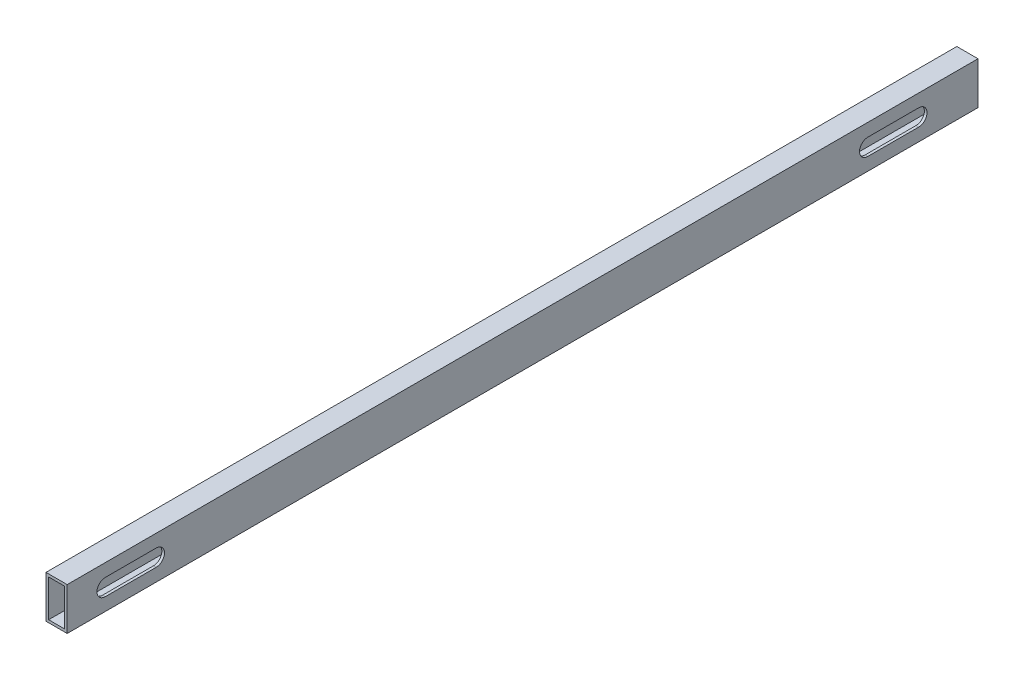
ISO-10303-21;
HEADER;
FILE_DESCRIPTION(('STEP AP214'),'2;1');
FILE_NAME('part.step','',(''),(''),'','','');
FILE_SCHEMA(('AUTOMOTIVE_DESIGN { 1 0 10303 214 1 1 1 1 }'));
ENDSEC;
DATA;
#1=APPLICATION_CONTEXT('core data for automotive mechanical design processes');
#2=APPLICATION_PROTOCOL_DEFINITION('international standard','automotive_design',2000,#1);
#3=PRODUCT_CONTEXT('',#1,'mechanical');
#4=PRODUCT('Part','Part','',(#3));
#5=PRODUCT_RELATED_PRODUCT_CATEGORY('part','',(#4));
#6=PRODUCT_DEFINITION_FORMATION('','',#4);
#7=PRODUCT_DEFINITION_CONTEXT('part definition',#1,'design');
#8=PRODUCT_DEFINITION('design','',#6,#7);
#9=PRODUCT_DEFINITION_SHAPE('','',#8);
#10=(LENGTH_UNIT() NAMED_UNIT(*) SI_UNIT(.MILLI.,.METRE.));
#11=(NAMED_UNIT(*) PLANE_ANGLE_UNIT() SI_UNIT($,.RADIAN.));
#12=(NAMED_UNIT(*) SI_UNIT($,.STERADIAN.) SOLID_ANGLE_UNIT());
#13=UNCERTAINTY_MEASURE_WITH_UNIT(LENGTH_MEASURE(1.E-05),#10,'distance_accuracy_value','');
#14=(GEOMETRIC_REPRESENTATION_CONTEXT(3) GLOBAL_UNCERTAINTY_ASSIGNED_CONTEXT((#13)) GLOBAL_UNIT_ASSIGNED_CONTEXT((#10,
#11,#12)) REPRESENTATION_CONTEXT('',''));
#15=CARTESIAN_POINT('',(0.,0.,0.));
#16=DIRECTION('',(0.,0.,1.));
#17=DIRECTION('',(1.,0.,0.));
#18=AXIS2_PLACEMENT_3D('',#15,#16,#17);
#19=CARTESIAN_POINT('',(6.35,-12.7,546.1));
#20=DIRECTION('',(-1.,0.,0.));
#21=DIRECTION('',(0.,0.,1.));
#22=AXIS2_PLACEMENT_3D('',#19,#20,#21);
#23=PLANE('',#22);
#24=DIRECTION('',(0.,0.,-1.));
#25=VECTOR('',#24,1.);
#26=CARTESIAN_POINT('',(6.35,5.,492.76));
#27=LINE('',#26,#25);
#28=CARTESIAN_POINT('',(6.35,5.,523.24));
#29=VERTEX_POINT('',#28);
#30=CARTESIAN_POINT('',(6.35,5.,492.76));
#31=VERTEX_POINT('',#30);
#32=EDGE_CURVE('E223',#29,#31,#27,.T.);
#33=ORIENTED_EDGE('',*,*,#32,.T.);
#34=CARTESIAN_POINT('',(6.35,0.,492.76));
#35=DIRECTION('',(-1.,0.,0.));
#36=DIRECTION('',(0.,0.,1.));
#37=AXIS2_PLACEMENT_3D('',#34,#35,#36);
#38=CIRCLE('',#37,5.);
#39=CARTESIAN_POINT('',(6.35,-5.,492.76));
#40=VERTEX_POINT('',#39);
#41=EDGE_CURVE('E216',#31,#40,#38,.T.);
#42=ORIENTED_EDGE('',*,*,#41,.T.);
#43=DIRECTION('',(0.,0.,1.));
#44=VECTOR('',#43,1.);
#45=CARTESIAN_POINT('',(6.35,-5.,492.76));
#46=LINE('',#45,#44);
#47=CARTESIAN_POINT('',(6.35,-5.,523.24));
#48=VERTEX_POINT('',#47);
#49=EDGE_CURVE('E59',#40,#48,#46,.T.);
#50=ORIENTED_EDGE('',*,*,#49,.T.);
#51=CARTESIAN_POINT('',(6.35,0.,523.24));
#52=DIRECTION('',(-1.,0.,0.));
#53=DIRECTION('',(0.,0.,1.));
#54=AXIS2_PLACEMENT_3D('',#51,#52,#53);
#55=CIRCLE('',#54,5.);
#56=EDGE_CURVE('E220',#48,#29,#55,.T.);
#57=ORIENTED_EDGE('',*,*,#56,.T.);
#58=EDGE_LOOP('',(#33,#42,#50,#57));
#59=FACE_BOUND('',#58,.T.);
#60=DIRECTION('',(0.,1.,0.));
#61=VECTOR('',#60,1.);
#62=CARTESIAN_POINT('',(6.35,-12.7,0.));
#63=LINE('',#62,#61);
#64=CARTESIAN_POINT('',(6.35,-12.7,0.));
#65=VERTEX_POINT('',#64);
#66=CARTESIAN_POINT('',(6.35,12.7,0.));
#67=VERTEX_POINT('',#66);
#68=EDGE_CURVE('E301',#65,#67,#63,.T.);
#69=ORIENTED_EDGE('',*,*,#68,.T.);
#70=DIRECTION('',(0.,0.,-1.));
#71=VECTOR('',#70,1.);
#72=CARTESIAN_POINT('',(6.35,12.7,546.1));
#73=LINE('',#72,#71);
#74=CARTESIAN_POINT('',(6.35,12.7,546.1));
#75=VERTEX_POINT('',#74);
#76=EDGE_CURVE('E328',#75,#67,#73,.T.);
#77=ORIENTED_EDGE('',*,*,#76,.F.);
#78=DIRECTION('',(0.,1.,0.));
#79=VECTOR('',#78,1.);
#80=CARTESIAN_POINT('',(6.35,-12.7,546.1));
#81=LINE('',#80,#79);
#82=CARTESIAN_POINT('',(6.35,-12.7,546.1));
#83=VERTEX_POINT('',#82);
#84=EDGE_CURVE('E302',#83,#75,#81,.T.);
#85=ORIENTED_EDGE('',*,*,#84,.F.);
#86=DIRECTION('',(0.,0.,-1.));
#87=VECTOR('',#86,1.);
#88=CARTESIAN_POINT('',(6.35,-12.7,546.1));
#89=LINE('',#88,#87);
#90=EDGE_CURVE('E312',#83,#65,#89,.T.);
#91=ORIENTED_EDGE('',*,*,#90,.T.);
#92=EDGE_LOOP('',(#69,#77,#85,#91));
#93=FACE_BOUND('',#92,.T.);
#94=DIRECTION('',(0.,0.,-1.));
#95=VECTOR('',#94,1.);
#96=CARTESIAN_POINT('',(6.35,5.,35.56));
#97=LINE('',#96,#95);
#98=CARTESIAN_POINT('',(6.35,5.,66.04));
#99=VERTEX_POINT('',#98);
#100=CARTESIAN_POINT('',(6.35,5.,35.56));
#101=VERTEX_POINT('',#100);
#102=EDGE_CURVE('E188',#99,#101,#97,.T.);
#103=ORIENTED_EDGE('',*,*,#102,.T.);
#104=CARTESIAN_POINT('',(6.35,0.,35.56));
#105=DIRECTION('',(-1.,0.,0.));
#106=DIRECTION('',(0.,0.,1.));
#107=AXIS2_PLACEMENT_3D('',#104,#105,#106);
#108=CIRCLE('',#107,5.);
#109=CARTESIAN_POINT('',(6.35,-5.,35.56));
#110=VERTEX_POINT('',#109);
#111=EDGE_CURVE('E192',#101,#110,#108,.T.);
#112=ORIENTED_EDGE('',*,*,#111,.T.);
#113=DIRECTION('',(0.,0.,1.));
#114=VECTOR('',#113,1.);
#115=CARTESIAN_POINT('',(6.35,-5.,35.56));
#116=LINE('',#115,#114);
#117=CARTESIAN_POINT('',(6.35,-5.,66.04));
#118=VERTEX_POINT('',#117);
#119=EDGE_CURVE('E51',#110,#118,#116,.T.);
#120=ORIENTED_EDGE('',*,*,#119,.T.);
#121=CARTESIAN_POINT('',(6.35,0.,66.04));
#122=DIRECTION('',(-1.,0.,0.));
#123=DIRECTION('',(0.,0.,1.));
#124=AXIS2_PLACEMENT_3D('',#121,#122,#123);
#125=CIRCLE('',#124,5.);
#126=EDGE_CURVE('E183',#118,#99,#125,.T.);
#127=ORIENTED_EDGE('',*,*,#126,.T.);
#128=EDGE_LOOP('',(#103,#112,#120,#127));
#129=FACE_BOUND('',#128,.T.);
#130=ADVANCED_FACE('F37',(#59,#93,#129),#23,.F.);
#131=CARTESIAN_POINT('',(4.7625,-11.1125,546.1));
#132=DIRECTION('',(-1.,0.,0.));
#133=DIRECTION('',(0.,0.,1.));
#134=AXIS2_PLACEMENT_3D('',#131,#132,#133);
#135=PLANE('',#134);
#136=CARTESIAN_POINT('',(4.7625,0.,492.76));
#137=DIRECTION('',(-1.,0.,0.));
#138=DIRECTION('',(0.,0.,1.));
#139=AXIS2_PLACEMENT_3D('',#136,#137,#138);
#140=CIRCLE('',#139,5.);
#141=CARTESIAN_POINT('',(4.7625,5.,492.76));
#142=VERTEX_POINT('',#141);
#143=CARTESIAN_POINT('',(4.7625,-5.,492.76));
#144=VERTEX_POINT('',#143);
#145=EDGE_CURVE('E213',#142,#144,#140,.T.);
#146=ORIENTED_EDGE('',*,*,#145,.F.);
#147=DIRECTION('',(0.,0.,-1.));
#148=VECTOR('',#147,1.);
#149=CARTESIAN_POINT('',(4.7625,5.,492.76));
#150=LINE('',#149,#148);
#151=CARTESIAN_POINT('',(4.7625,5.,523.24));
#152=VERTEX_POINT('',#151);
#153=EDGE_CURVE('E234',#152,#142,#150,.T.);
#154=ORIENTED_EDGE('',*,*,#153,.F.);
#155=CARTESIAN_POINT('',(4.7625,0.,523.24));
#156=DIRECTION('',(-1.,0.,0.));
#157=DIRECTION('',(0.,0.,1.));
#158=AXIS2_PLACEMENT_3D('',#155,#156,#157);
#159=CIRCLE('',#158,5.);
#160=CARTESIAN_POINT('',(4.7625,-5.,523.24));
#161=VERTEX_POINT('',#160);
#162=EDGE_CURVE('E206',#161,#152,#159,.T.);
#163=ORIENTED_EDGE('',*,*,#162,.F.);
#164=DIRECTION('',(0.,0.,1.));
#165=VECTOR('',#164,1.);
#166=CARTESIAN_POINT('',(4.7625,-5.,492.76));
#167=LINE('',#166,#165);
#168=EDGE_CURVE('E209',#144,#161,#167,.T.);
#169=ORIENTED_EDGE('',*,*,#168,.F.);
#170=EDGE_LOOP('',(#146,#154,#163,#169));
#171=FACE_BOUND('',#170,.T.);
#172=DIRECTION('',(0.,1.,0.));
#173=VECTOR('',#172,1.);
#174=CARTESIAN_POINT('',(4.7625,-11.1125,0.));
#175=LINE('',#174,#173);
#176=CARTESIAN_POINT('',(4.7625,-11.1125,0.));
#177=VERTEX_POINT('',#176);
#178=CARTESIAN_POINT('',(4.7625,11.1125,0.));
#179=VERTEX_POINT('',#178);
#180=EDGE_CURVE('E280',#177,#179,#175,.T.);
#181=ORIENTED_EDGE('',*,*,#180,.F.);
#182=DIRECTION('',(0.,0.,-1.));
#183=VECTOR('',#182,1.);
#184=CARTESIAN_POINT('',(4.7625,-11.1125,546.1));
#185=LINE('',#184,#183);
#186=CARTESIAN_POINT('',(4.7625,-11.1125,546.1));
#187=VERTEX_POINT('',#186);
#188=EDGE_CURVE('E279',#187,#177,#185,.T.);
#189=ORIENTED_EDGE('',*,*,#188,.F.);
#190=DIRECTION('',(0.,1.,0.));
#191=VECTOR('',#190,1.);
#192=CARTESIAN_POINT('',(4.7625,-11.1125,546.1));
#193=LINE('',#192,#191);
#194=CARTESIAN_POINT('',(4.7625,11.1125,546.1));
#195=VERTEX_POINT('',#194);
#196=EDGE_CURVE('E269',#187,#195,#193,.T.);
#197=ORIENTED_EDGE('',*,*,#196,.T.);
#198=DIRECTION('',(0.,0.,-1.));
#199=VECTOR('',#198,1.);
#200=CARTESIAN_POINT('',(4.7625,11.1125,546.1));
#201=LINE('',#200,#199);
#202=EDGE_CURVE('E298',#195,#179,#201,.T.);
#203=ORIENTED_EDGE('',*,*,#202,.T.);
#204=EDGE_LOOP('',(#181,#189,#197,#203));
#205=FACE_BOUND('',#204,.T.);
#206=CARTESIAN_POINT('',(4.7625,0.,35.56));
#207=DIRECTION('',(-1.,0.,0.));
#208=DIRECTION('',(0.,0.,1.));
#209=AXIS2_PLACEMENT_3D('',#206,#207,#208);
#210=CIRCLE('',#209,5.);
#211=CARTESIAN_POINT('',(4.7625,5.00000000000001,35.56));
#212=VERTEX_POINT('',#211);
#213=CARTESIAN_POINT('',(4.7625,-5.,35.56));
#214=VERTEX_POINT('',#213);
#215=EDGE_CURVE('E194',#212,#214,#210,.T.);
#216=ORIENTED_EDGE('',*,*,#215,.F.);
#217=DIRECTION('',(0.,0.,-1.));
#218=VECTOR('',#217,1.);
#219=CARTESIAN_POINT('',(4.7625,5.,35.56));
#220=LINE('',#219,#218);
#221=CARTESIAN_POINT('',(4.7625,5.,66.04));
#222=VERTEX_POINT('',#221);
#223=EDGE_CURVE('E203',#222,#212,#220,.T.);
#224=ORIENTED_EDGE('',*,*,#223,.F.);
#225=CARTESIAN_POINT('',(4.7625,0.,66.04));
#226=DIRECTION('',(-1.,0.,0.));
#227=DIRECTION('',(0.,0.,1.));
#228=AXIS2_PLACEMENT_3D('',#225,#226,#227);
#229=CIRCLE('',#228,5.);
#230=CARTESIAN_POINT('',(4.7625,-5.,66.04));
#231=VERTEX_POINT('',#230);
#232=EDGE_CURVE('E236',#231,#222,#229,.T.);
#233=ORIENTED_EDGE('',*,*,#232,.F.);
#234=DIRECTION('',(0.,0.,1.));
#235=VECTOR('',#234,1.);
#236=CARTESIAN_POINT('',(4.7625,-5.,35.56));
#237=LINE('',#236,#235);
#238=EDGE_CURVE('E175',#214,#231,#237,.T.);
#239=ORIENTED_EDGE('',*,*,#238,.F.);
#240=EDGE_LOOP('',(#216,#224,#233,#239));
#241=FACE_BOUND('',#240,.T.);
#242=ADVANCED_FACE('F398',(#171,#205,#241),#135,.T.);
#243=CARTESIAN_POINT('',(0.,0.,546.1));
#244=DIRECTION('',(0.,0.,-1.));
#245=DIRECTION('',(-1.,0.,0.));
#246=AXIS2_PLACEMENT_3D('',#243,#244,#245);
#247=PLANE('',#246);
#248=ORIENTED_EDGE('',*,*,#84,.T.);
#249=DIRECTION('',(-1.,0.,0.));
#250=VECTOR('',#249,1.);
#251=CARTESIAN_POINT('',(-6.35,12.7,546.1));
#252=LINE('',#251,#250);
#253=CARTESIAN_POINT('',(-6.35,12.7,546.1));
#254=VERTEX_POINT('',#253);
#255=EDGE_CURVE('E305',#75,#254,#252,.T.);
#256=ORIENTED_EDGE('',*,*,#255,.T.);
#257=DIRECTION('',(0.,-1.,0.));
#258=VECTOR('',#257,1.);
#259=CARTESIAN_POINT('',(-6.35,-12.7,546.1));
#260=LINE('',#259,#258);
#261=CARTESIAN_POINT('',(-6.35,-12.7,546.1));
#262=VERTEX_POINT('',#261);
#263=EDGE_CURVE('E308',#254,#262,#260,.T.);
#264=ORIENTED_EDGE('',*,*,#263,.T.);
#265=DIRECTION('',(1.,0.,0.));
#266=VECTOR('',#265,1.);
#267=CARTESIAN_POINT('',(-6.35,-12.7,546.1));
#268=LINE('',#267,#266);
#269=EDGE_CURVE('E310',#262,#83,#268,.T.);
#270=ORIENTED_EDGE('',*,*,#269,.T.);
#271=EDGE_LOOP('',(#248,#256,#264,#270));
#272=FACE_BOUND('',#271,.T.);
#273=ORIENTED_EDGE('',*,*,#196,.F.);
#274=DIRECTION('',(1.,0.,0.));
#275=VECTOR('',#274,1.);
#276=CARTESIAN_POINT('',(-4.7625,-11.1125,546.1));
#277=LINE('',#276,#275);
#278=CARTESIAN_POINT('',(-4.7625,-11.1125,546.1));
#279=VERTEX_POINT('',#278);
#280=EDGE_CURVE('E277',#279,#187,#277,.T.);
#281=ORIENTED_EDGE('',*,*,#280,.F.);
#282=DIRECTION('',(0.,-1.,0.));
#283=VECTOR('',#282,1.);
#284=CARTESIAN_POINT('',(-4.7625,-11.1125,546.1));
#285=LINE('',#284,#283);
#286=CARTESIAN_POINT('',(-4.7625,11.1125,546.1));
#287=VERTEX_POINT('',#286);
#288=EDGE_CURVE('E274',#287,#279,#285,.T.);
#289=ORIENTED_EDGE('',*,*,#288,.F.);
#290=DIRECTION('',(-1.,0.,0.));
#291=VECTOR('',#290,1.);
#292=CARTESIAN_POINT('',(-4.7625,11.1125,546.1));
#293=LINE('',#292,#291);
#294=EDGE_CURVE('E271',#195,#287,#293,.T.);
#295=ORIENTED_EDGE('',*,*,#294,.F.);
#296=EDGE_LOOP('',(#273,#281,#289,#295));
#297=FACE_BOUND('',#296,.T.);
#298=ADVANCED_FACE('F389',(#272,#297),#247,.F.);
#299=CARTESIAN_POINT('',(0.,0.,0.));
#300=DIRECTION('',(0.,0.,-1.));
#301=DIRECTION('',(-1.,0.,0.));
#302=AXIS2_PLACEMENT_3D('',#299,#300,#301);
#303=PLANE('',#302);
#304=ORIENTED_EDGE('',*,*,#68,.F.);
#305=DIRECTION('',(1.,0.,0.));
#306=VECTOR('',#305,1.);
#307=CARTESIAN_POINT('',(-6.35,-12.7,0.));
#308=LINE('',#307,#306);
#309=CARTESIAN_POINT('',(-6.35,-12.7,0.));
#310=VERTEX_POINT('',#309);
#311=EDGE_CURVE('E306',#310,#65,#308,.T.);
#312=ORIENTED_EDGE('',*,*,#311,.F.);
#313=DIRECTION('',(0.,-1.,0.));
#314=VECTOR('',#313,1.);
#315=CARTESIAN_POINT('',(-6.35,-12.7,0.));
#316=LINE('',#315,#314);
#317=CARTESIAN_POINT('',(-6.35,12.7,0.));
#318=VERTEX_POINT('',#317);
#319=EDGE_CURVE('E317',#318,#310,#316,.T.);
#320=ORIENTED_EDGE('',*,*,#319,.F.);
#321=DIRECTION('',(-1.,0.,0.));
#322=VECTOR('',#321,1.);
#323=CARTESIAN_POINT('',(-6.35,12.7,0.));
#324=LINE('',#323,#322);
#325=EDGE_CURVE('E315',#67,#318,#324,.T.);
#326=ORIENTED_EDGE('',*,*,#325,.F.);
#327=EDGE_LOOP('',(#304,#312,#320,#326));
#328=FACE_BOUND('',#327,.T.);
#329=DIRECTION('',(1.,0.,0.));
#330=VECTOR('',#329,1.);
#331=CARTESIAN_POINT('',(-4.7625,-11.1125,0.));
#332=LINE('',#331,#330);
#333=CARTESIAN_POINT('',(-4.7625,-11.1125,0.));
#334=VERTEX_POINT('',#333);
#335=EDGE_CURVE('E272',#334,#177,#332,.T.);
#336=ORIENTED_EDGE('',*,*,#335,.T.);
#337=ORIENTED_EDGE('',*,*,#180,.T.);
#338=DIRECTION('',(-1.,0.,0.));
#339=VECTOR('',#338,1.);
#340=CARTESIAN_POINT('',(-4.7625,11.1125,0.));
#341=LINE('',#340,#339);
#342=CARTESIAN_POINT('',(-4.7625,11.1125,0.));
#343=VERTEX_POINT('',#342);
#344=EDGE_CURVE('E283',#179,#343,#341,.T.);
#345=ORIENTED_EDGE('',*,*,#344,.T.);
#346=DIRECTION('',(0.,-1.,0.));
#347=VECTOR('',#346,1.);
#348=CARTESIAN_POINT('',(-4.7625,-11.1125,0.));
#349=LINE('',#348,#347);
#350=EDGE_CURVE('E287',#343,#334,#349,.T.);
#351=ORIENTED_EDGE('',*,*,#350,.T.);
#352=EDGE_LOOP('',(#336,#337,#345,#351));
#353=FACE_BOUND('',#352,.T.);
#354=ADVANCED_FACE('F383',(#328,#353),#303,.T.);
#355=CARTESIAN_POINT('',(-6.35,12.7,546.1));
#356=DIRECTION('',(0.,-1.,0.));
#357=DIRECTION('',(0.,0.,-1.));
#358=AXIS2_PLACEMENT_3D('',#355,#356,#357);
#359=PLANE('',#358);
#360=ORIENTED_EDGE('',*,*,#325,.T.);
#361=DIRECTION('',(0.,0.,-1.));
#362=VECTOR('',#361,1.);
#363=CARTESIAN_POINT('',(-6.35,12.7,546.1));
#364=LINE('',#363,#362);
#365=EDGE_CURVE('E325',#254,#318,#364,.T.);
#366=ORIENTED_EDGE('',*,*,#365,.F.);
#367=ORIENTED_EDGE('',*,*,#255,.F.);
#368=ORIENTED_EDGE('',*,*,#76,.T.);
#369=EDGE_LOOP('',(#360,#366,#367,#368));
#370=FACE_BOUND('',#369,.T.);
#371=ADVANCED_FACE('F365',(#370),#359,.F.);
#372=CARTESIAN_POINT('',(-6.35,-12.7,546.1));
#373=DIRECTION('',(1.,0.,0.));
#374=DIRECTION('',(0.,0.,-1.));
#375=AXIS2_PLACEMENT_3D('',#372,#373,#374);
#376=PLANE('',#375);
#377=DIRECTION('',(0.,0.,-1.));
#378=VECTOR('',#377,1.);
#379=CARTESIAN_POINT('',(-6.35,-3.30199999999994,44.45));
#380=LINE('',#379,#378);
#381=CARTESIAN_POINT('',(-6.35,-3.30199999999992,57.15));
#382=VERTEX_POINT('',#381);
#383=CARTESIAN_POINT('',(-6.35,-3.30199999999994,44.45));
#384=VERTEX_POINT('',#383);
#385=EDGE_CURVE('E249',#382,#384,#380,.T.);
#386=ORIENTED_EDGE('',*,*,#385,.T.);
#387=CARTESIAN_POINT('',(-6.35,0.,44.45));
#388=DIRECTION('',(1.,0.,0.));
#389=DIRECTION('',(0.,0.,-1.));
#390=AXIS2_PLACEMENT_3D('',#387,#388,#389);
#391=CIRCLE('',#390,3.302);
#392=CARTESIAN_POINT('',(-6.35,3.30200000000006,44.45));
#393=VERTEX_POINT('',#392);
#394=EDGE_CURVE('E240',#384,#393,#391,.T.);
#395=ORIENTED_EDGE('',*,*,#394,.T.);
#396=DIRECTION('',(0.,0.,1.));
#397=VECTOR('',#396,1.);
#398=CARTESIAN_POINT('',(-6.35,3.30200000000006,44.45));
#399=LINE('',#398,#397);
#400=CARTESIAN_POINT('',(-6.35,3.30200000000008,57.15));
#401=VERTEX_POINT('',#400);
#402=EDGE_CURVE('E243',#393,#401,#399,.T.);
#403=ORIENTED_EDGE('',*,*,#402,.T.);
#404=CARTESIAN_POINT('',(-6.35,0.,57.15));
#405=DIRECTION('',(1.,0.,0.));
#406=DIRECTION('',(0.,0.,-1.));
#407=AXIS2_PLACEMENT_3D('',#404,#405,#406);
#408=CIRCLE('',#407,3.302);
#409=EDGE_CURVE('E246',#401,#382,#408,.T.);
#410=ORIENTED_EDGE('',*,*,#409,.T.);
#411=EDGE_LOOP('',(#386,#395,#403,#410));
#412=FACE_BOUND('',#411,.T.);
#413=CARTESIAN_POINT('',(-6.35,0.,523.24));
#414=DIRECTION('',(1.,0.,0.));
#415=DIRECTION('',(0.,0.,-1.));
#416=AXIS2_PLACEMENT_3D('',#413,#414,#415);
#417=CIRCLE('',#416,2.75000000000004);
#418=CARTESIAN_POINT('',(-6.35,0.,520.49));
#419=VERTEX_POINT('',#418);
#420=EDGE_CURVE('E239',#419,#419,#417,.T.);
#421=ORIENTED_EDGE('',*,*,#420,.T.);
#422=EDGE_LOOP('',(#421));
#423=FACE_BOUND('',#422,.T.);
#424=CARTESIAN_POINT('',(-6.35,0.,492.76));
#425=DIRECTION('',(1.,0.,0.));
#426=DIRECTION('',(0.,0.,1.));
#427=AXIS2_PLACEMENT_3D('',#424,#425,#426);
#428=CIRCLE('',#427,2.75000000000004);
#429=CARTESIAN_POINT('',(-6.35,0.,495.51));
#430=VERTEX_POINT('',#429);
#431=EDGE_CURVE('E205',#430,#430,#428,.T.);
#432=ORIENTED_EDGE('',*,*,#431,.T.);
#433=EDGE_LOOP('',(#432));
#434=FACE_BOUND('',#433,.T.);
#435=CARTESIAN_POINT('',(-6.35,0.,508.));
#436=DIRECTION('',(1.,0.,0.));
#437=DIRECTION('',(0.,0.,-1.));
#438=AXIS2_PLACEMENT_3D('',#435,#436,#437);
#439=CIRCLE('',#438,3.80999999999999);
#440=CARTESIAN_POINT('',(-6.35,0.,504.19));
#441=VERTEX_POINT('',#440);
#442=EDGE_CURVE('E256',#441,#441,#439,.T.);
#443=ORIENTED_EDGE('',*,*,#442,.T.);
#444=EDGE_LOOP('',(#443));
#445=FACE_BOUND('',#444,.T.);
#446=ORIENTED_EDGE('',*,*,#319,.T.);
#447=DIRECTION('',(0.,0.,-1.));
#448=VECTOR('',#447,1.);
#449=CARTESIAN_POINT('',(-6.35,-12.7,546.1));
#450=LINE('',#449,#448);
#451=EDGE_CURVE('E322',#262,#310,#450,.T.);
#452=ORIENTED_EDGE('',*,*,#451,.F.);
#453=ORIENTED_EDGE('',*,*,#263,.F.);
#454=ORIENTED_EDGE('',*,*,#365,.T.);
#455=EDGE_LOOP('',(#446,#452,#453,#454));
#456=FACE_BOUND('',#455,.T.);
#457=ADVANCED_FACE('F361',(#412,#423,#434,#445,#456),#376,.F.);
#458=CARTESIAN_POINT('',(-6.35,-12.7,546.1));
#459=DIRECTION('',(0.,1.,0.));
#460=DIRECTION('',(0.,0.,1.));
#461=AXIS2_PLACEMENT_3D('',#458,#459,#460);
#462=PLANE('',#461);
#463=CARTESIAN_POINT('',(0.,-12.7,533.4));
#464=DIRECTION('',(0.,-1.,0.));
#465=DIRECTION('',(0.,0.,-1.));
#466=AXIS2_PLACEMENT_3D('',#463,#464,#465);
#467=CIRCLE('',#466,2.74999999999992);
#468=CARTESIAN_POINT('',(0.,-12.7,530.65));
#469=VERTEX_POINT('',#468);
#470=EDGE_CURVE('E210',#469,#469,#467,.T.);
#471=ORIENTED_EDGE('',*,*,#470,.F.);
#472=EDGE_LOOP('',(#471));
#473=FACE_BOUND('',#472,.T.);
#474=CARTESIAN_POINT('',(0.,-12.7,12.7000000000003));
#475=DIRECTION('',(0.,-1.,0.));
#476=DIRECTION('',(0.,0.,1.));
#477=AXIS2_PLACEMENT_3D('',#474,#475,#476);
#478=CIRCLE('',#477,2.74999999999992);
#479=CARTESIAN_POINT('',(0.,-12.7,9.95000000000034));
#480=VERTEX_POINT('',#479);
#481=EDGE_CURVE('E475',#480,#480,#478,.T.);
#482=ORIENTED_EDGE('',*,*,#481,.F.);
#483=EDGE_LOOP('',(#482));
#484=FACE_BOUND('',#483,.T.);
#485=ORIENTED_EDGE('',*,*,#311,.T.);
#486=ORIENTED_EDGE('',*,*,#90,.F.);
#487=ORIENTED_EDGE('',*,*,#269,.F.);
#488=ORIENTED_EDGE('',*,*,#451,.T.);
#489=EDGE_LOOP('',(#485,#486,#487,#488));
#490=FACE_BOUND('',#489,.T.);
#491=ADVANCED_FACE('F364',(#473,#484,#490),#462,.F.);
#492=CARTESIAN_POINT('',(-4.7625,11.1125,546.1));
#493=DIRECTION('',(0.,-1.,0.));
#494=DIRECTION('',(0.,0.,-1.));
#495=AXIS2_PLACEMENT_3D('',#492,#493,#494);
#496=PLANE('',#495);
#497=ORIENTED_EDGE('',*,*,#344,.F.);
#498=ORIENTED_EDGE('',*,*,#202,.F.);
#499=ORIENTED_EDGE('',*,*,#294,.T.);
#500=DIRECTION('',(0.,0.,-1.));
#501=VECTOR('',#500,1.);
#502=CARTESIAN_POINT('',(-4.7625,11.1125,546.1));
#503=LINE('',#502,#501);
#504=EDGE_CURVE('E296',#287,#343,#503,.T.);
#505=ORIENTED_EDGE('',*,*,#504,.T.);
#506=EDGE_LOOP('',(#497,#498,#499,#505));
#507=FACE_BOUND('',#506,.T.);
#508=ADVANCED_FACE('F460',(#507),#496,.T.);
#509=CARTESIAN_POINT('',(-4.7625,-11.1125,546.1));
#510=DIRECTION('',(1.,0.,0.));
#511=DIRECTION('',(0.,0.,-1.));
#512=AXIS2_PLACEMENT_3D('',#509,#510,#511);
#513=PLANE('',#512);
#514=CARTESIAN_POINT('',(-4.7625,0.,44.45));
#515=DIRECTION('',(1.,0.,0.));
#516=DIRECTION('',(0.,0.,-1.));
#517=AXIS2_PLACEMENT_3D('',#514,#515,#516);
#518=CIRCLE('',#517,3.302);
#519=CARTESIAN_POINT('',(-4.7625,-3.30199999999994,44.45));
#520=VERTEX_POINT('',#519);
#521=CARTESIAN_POINT('',(-4.7625,3.30200000000006,44.45));
#522=VERTEX_POINT('',#521);
#523=EDGE_CURVE('E11',#520,#522,#518,.T.);
#524=ORIENTED_EDGE('',*,*,#523,.F.);
#525=DIRECTION('',(0.,0.,-1.));
#526=VECTOR('',#525,1.);
#527=CARTESIAN_POINT('',(-4.7625,-3.30199999999924,546.1));
#528=LINE('',#527,#526);
#529=CARTESIAN_POINT('',(-4.7625,-3.30199999999992,57.15));
#530=VERTEX_POINT('',#529);
#531=EDGE_CURVE('E44',#530,#520,#528,.T.);
#532=ORIENTED_EDGE('',*,*,#531,.F.);
#533=CARTESIAN_POINT('',(-4.7625,0.,57.15));
#534=DIRECTION('',(1.,0.,0.));
#535=DIRECTION('',(0.,0.,-1.));
#536=AXIS2_PLACEMENT_3D('',#533,#534,#535);
#537=CIRCLE('',#536,3.302);
#538=CARTESIAN_POINT('',(-4.7625,3.30200000000008,57.15));
#539=VERTEX_POINT('',#538);
#540=EDGE_CURVE('E340',#539,#530,#537,.T.);
#541=ORIENTED_EDGE('',*,*,#540,.F.);
#542=DIRECTION('',(0.,0.,1.));
#543=VECTOR('',#542,1.);
#544=CARTESIAN_POINT('',(-4.7625,3.30200000000076,546.1));
#545=LINE('',#544,#543);
#546=EDGE_CURVE('E331',#522,#539,#545,.T.);
#547=ORIENTED_EDGE('',*,*,#546,.F.);
#548=EDGE_LOOP('',(#524,#532,#541,#547));
#549=FACE_BOUND('',#548,.T.);
#550=CARTESIAN_POINT('',(-4.7625,0.,523.24));
#551=DIRECTION('',(1.,0.,0.));
#552=DIRECTION('',(0.,0.,-1.));
#553=AXIS2_PLACEMENT_3D('',#550,#551,#552);
#554=CIRCLE('',#553,2.75000000000004);
#555=CARTESIAN_POINT('',(-4.7625,0.,520.49));
#556=VERTEX_POINT('',#555);
#557=EDGE_CURVE('E284',#556,#556,#554,.T.);
#558=ORIENTED_EDGE('',*,*,#557,.F.);
#559=EDGE_LOOP('',(#558));
#560=FACE_BOUND('',#559,.T.);
#561=CARTESIAN_POINT('',(-4.7625,0.,492.76));
#562=DIRECTION('',(1.,0.,0.));
#563=DIRECTION('',(0.,0.,-1.));
#564=AXIS2_PLACEMENT_3D('',#561,#562,#563);
#565=CIRCLE('',#564,2.75000000000004);
#566=CARTESIAN_POINT('',(-4.7625,0.,490.01));
#567=VERTEX_POINT('',#566);
#568=EDGE_CURVE('E334',#567,#567,#565,.T.);
#569=ORIENTED_EDGE('',*,*,#568,.F.);
#570=EDGE_LOOP('',(#569));
#571=FACE_BOUND('',#570,.T.);
#572=CARTESIAN_POINT('',(-4.7625,0.,508.));
#573=DIRECTION('',(1.,0.,0.));
#574=DIRECTION('',(0.,0.,-1.));
#575=AXIS2_PLACEMENT_3D('',#572,#573,#574);
#576=CIRCLE('',#575,3.80999999999999);
#577=CARTESIAN_POINT('',(-4.7625,0.,504.19));
#578=VERTEX_POINT('',#577);
#579=EDGE_CURVE('E268',#578,#578,#576,.T.);
#580=ORIENTED_EDGE('',*,*,#579,.F.);
#581=EDGE_LOOP('',(#580));
#582=FACE_BOUND('',#581,.T.);
#583=ORIENTED_EDGE('',*,*,#350,.F.);
#584=ORIENTED_EDGE('',*,*,#504,.F.);
#585=ORIENTED_EDGE('',*,*,#288,.T.);
#586=DIRECTION('',(0.,0.,-1.));
#587=VECTOR('',#586,1.);
#588=CARTESIAN_POINT('',(-4.7625,-11.1125,546.1));
#589=LINE('',#588,#587);
#590=EDGE_CURVE('E294',#279,#334,#589,.T.);
#591=ORIENTED_EDGE('',*,*,#590,.T.);
#592=EDGE_LOOP('',(#583,#584,#585,#591));
#593=FACE_BOUND('',#592,.T.);
#594=ADVANCED_FACE('F352',(#549,#560,#571,#582,#593),#513,.T.);
#595=CARTESIAN_POINT('',(-4.7625,-11.1125,546.1));
#596=DIRECTION('',(0.,1.,0.));
#597=DIRECTION('',(0.,0.,1.));
#598=AXIS2_PLACEMENT_3D('',#595,#596,#597);
#599=PLANE('',#598);
#600=CARTESIAN_POINT('',(0.,-11.1125,533.4));
#601=DIRECTION('',(0.,1.,0.));
#602=DIRECTION('',(0.,0.,1.));
#603=AXIS2_PLACEMENT_3D('',#600,#601,#602);
#604=CIRCLE('',#603,2.74999999999992);
#605=CARTESIAN_POINT('',(0.,-11.1125,530.65));
#606=VERTEX_POINT('',#605);
#607=EDGE_CURVE('E477',#606,#606,#604,.F.);
#608=ORIENTED_EDGE('',*,*,#607,.T.);
#609=EDGE_LOOP('',(#608));
#610=FACE_BOUND('',#609,.T.);
#611=CARTESIAN_POINT('',(0.,-11.1125,12.7000000000003));
#612=DIRECTION('',(0.,1.,0.));
#613=DIRECTION('',(0.,0.,1.));
#614=AXIS2_PLACEMENT_3D('',#611,#612,#613);
#615=CIRCLE('',#614,2.74999999999992);
#616=CARTESIAN_POINT('',(0.,-11.1125,9.95000000000034));
#617=VERTEX_POINT('',#616);
#618=EDGE_CURVE('E478',#617,#617,#615,.F.);
#619=ORIENTED_EDGE('',*,*,#618,.T.);
#620=EDGE_LOOP('',(#619));
#621=FACE_BOUND('',#620,.T.);
#622=ORIENTED_EDGE('',*,*,#335,.F.);
#623=ORIENTED_EDGE('',*,*,#590,.F.);
#624=ORIENTED_EDGE('',*,*,#280,.T.);
#625=ORIENTED_EDGE('',*,*,#188,.T.);
#626=EDGE_LOOP('',(#622,#623,#624,#625));
#627=FACE_BOUND('',#626,.T.);
#628=ADVANCED_FACE('F453',(#610,#621,#627),#599,.T.);
#629=CARTESIAN_POINT('',(-6.35,0.,508.));
#630=DIRECTION('',(1.,0.,0.));
#631=DIRECTION('',(0.,0.,-1.));
#632=AXIS2_PLACEMENT_3D('',#629,#630,#631);
#633=CYLINDRICAL_SURFACE('',#632,3.80999999999999);
#634=ORIENTED_EDGE('',*,*,#579,.T.);
#635=EDGE_LOOP('',(#634));
#636=FACE_BOUND('',#635,.T.);
#637=ORIENTED_EDGE('',*,*,#442,.F.);
#638=EDGE_LOOP('',(#637));
#639=FACE_BOUND('',#638,.T.);
#640=ADVANCED_FACE('F438',(#636,#639),#633,.F.);
#641=CARTESIAN_POINT('',(-6.35,0.,492.76));
#642=DIRECTION('',(1.,0.,0.));
#643=DIRECTION('',(0.,0.,-1.));
#644=AXIS2_PLACEMENT_3D('',#641,#642,#643);
#645=CYLINDRICAL_SURFACE('',#644,2.75000000000004);
#646=ORIENTED_EDGE('',*,*,#568,.T.);
#647=EDGE_LOOP('',(#646));
#648=FACE_BOUND('',#647,.T.);
#649=ORIENTED_EDGE('',*,*,#431,.F.);
#650=EDGE_LOOP('',(#649));
#651=FACE_BOUND('',#650,.T.);
#652=ADVANCED_FACE('F434',(#648,#651),#645,.F.);
#653=CARTESIAN_POINT('',(-6.35,0.,523.24));
#654=DIRECTION('',(1.,0.,0.));
#655=DIRECTION('',(0.,0.,-1.));
#656=AXIS2_PLACEMENT_3D('',#653,#654,#655);
#657=CYLINDRICAL_SURFACE('',#656,2.75000000000004);
#658=ORIENTED_EDGE('',*,*,#557,.T.);
#659=EDGE_LOOP('',(#658));
#660=FACE_BOUND('',#659,.T.);
#661=ORIENTED_EDGE('',*,*,#420,.F.);
#662=EDGE_LOOP('',(#661));
#663=FACE_BOUND('',#662,.T.);
#664=ADVANCED_FACE('F437',(#660,#663),#657,.F.);
#665=CARTESIAN_POINT('',(-6.35,3.30200000000006,44.45));
#666=DIRECTION('',(0.,1.,0.));
#667=DIRECTION('',(0.,0.,1.));
#668=AXIS2_PLACEMENT_3D('',#665,#666,#667);
#669=PLANE('',#668);
#670=ORIENTED_EDGE('',*,*,#546,.T.);
#671=DIRECTION('',(1.,0.,0.));
#672=VECTOR('',#671,1.);
#673=CARTESIAN_POINT('',(-6.35,3.30200000000008,57.15));
#674=LINE('',#673,#672);
#675=EDGE_CURVE('E260',#401,#539,#674,.T.);
#676=ORIENTED_EDGE('',*,*,#675,.F.);
#677=ORIENTED_EDGE('',*,*,#402,.F.);
#678=DIRECTION('',(1.,0.,0.));
#679=VECTOR('',#678,1.);
#680=CARTESIAN_POINT('',(-6.35,3.30200000000006,44.45));
#681=LINE('',#680,#679);
#682=EDGE_CURVE('E252',#393,#522,#681,.T.);
#683=ORIENTED_EDGE('',*,*,#682,.T.);
#684=EDGE_LOOP('',(#670,#676,#677,#683));
#685=FACE_BOUND('',#684,.T.);
#686=ADVANCED_FACE('F356',(#685),#669,.F.);
#687=CARTESIAN_POINT('',(-6.35,0.,57.15));
#688=DIRECTION('',(1.,0.,0.));
#689=DIRECTION('',(0.,0.,-1.));
#690=AXIS2_PLACEMENT_3D('',#687,#688,#689);
#691=CYLINDRICAL_SURFACE('',#690,3.302);
#692=ORIENTED_EDGE('',*,*,#540,.T.);
#693=DIRECTION('',(1.,0.,0.));
#694=VECTOR('',#693,1.);
#695=CARTESIAN_POINT('',(-6.35,-3.30199999999992,57.15));
#696=LINE('',#695,#694);
#697=EDGE_CURVE('E257',#382,#530,#696,.T.);
#698=ORIENTED_EDGE('',*,*,#697,.F.);
#699=ORIENTED_EDGE('',*,*,#409,.F.);
#700=ORIENTED_EDGE('',*,*,#675,.T.);
#701=EDGE_LOOP('',(#692,#698,#699,#700));
#702=FACE_BOUND('',#701,.T.);
#703=ADVANCED_FACE('F359',(#702),#691,.F.);
#704=CARTESIAN_POINT('',(-6.35,-3.30199999999994,44.45));
#705=DIRECTION('',(0.,-1.,0.));
#706=DIRECTION('',(0.,0.,-1.));
#707=AXIS2_PLACEMENT_3D('',#704,#705,#706);
#708=PLANE('',#707);
#709=ORIENTED_EDGE('',*,*,#531,.T.);
#710=DIRECTION('',(1.,0.,0.));
#711=VECTOR('',#710,1.);
#712=CARTESIAN_POINT('',(-6.35,-3.30199999999994,44.45));
#713=LINE('',#712,#711);
#714=EDGE_CURVE('E253',#384,#520,#713,.T.);
#715=ORIENTED_EDGE('',*,*,#714,.F.);
#716=ORIENTED_EDGE('',*,*,#385,.F.);
#717=ORIENTED_EDGE('',*,*,#697,.T.);
#718=EDGE_LOOP('',(#709,#715,#716,#717));
#719=FACE_BOUND('',#718,.T.);
#720=ADVANCED_FACE('F343',(#719),#708,.F.);
#721=CARTESIAN_POINT('',(-6.35,0.,44.45));
#722=DIRECTION('',(1.,0.,0.));
#723=DIRECTION('',(0.,0.,-1.));
#724=AXIS2_PLACEMENT_3D('',#721,#722,#723);
#725=CYLINDRICAL_SURFACE('',#724,3.302);
#726=ORIENTED_EDGE('',*,*,#523,.T.);
#727=ORIENTED_EDGE('',*,*,#682,.F.);
#728=ORIENTED_EDGE('',*,*,#394,.F.);
#729=ORIENTED_EDGE('',*,*,#714,.T.);
#730=EDGE_LOOP('',(#726,#727,#728,#729));
#731=FACE_BOUND('',#730,.T.);
#732=ADVANCED_FACE('F350',(#731),#725,.F.);
#733=CARTESIAN_POINT('',(-6.351,5.,492.76));
#734=DIRECTION('',(0.,-1.,0.));
#735=DIRECTION('',(0.,0.,-1.));
#736=AXIS2_PLACEMENT_3D('',#733,#734,#735);
#737=PLANE('',#736);
#738=ORIENTED_EDGE('',*,*,#153,.T.);
#739=DIRECTION('',(1.,0.,0.));
#740=VECTOR('',#739,1.);
#741=CARTESIAN_POINT('',(-6.351,5.,492.76));
#742=LINE('',#741,#740);
#743=EDGE_CURVE('E226',#142,#31,#742,.T.);
#744=ORIENTED_EDGE('',*,*,#743,.T.);
#745=ORIENTED_EDGE('',*,*,#32,.F.);
#746=DIRECTION('',(1.,0.,0.));
#747=VECTOR('',#746,1.);
#748=CARTESIAN_POINT('',(-6.351,5.,523.24));
#749=LINE('',#748,#747);
#750=EDGE_CURVE('E228',#152,#29,#749,.T.);
#751=ORIENTED_EDGE('',*,*,#750,.F.);
#752=EDGE_LOOP('',(#738,#744,#745,#751));
#753=FACE_BOUND('',#752,.T.);
#754=ADVANCED_FACE('F409',(#753),#737,.T.);
#755=CARTESIAN_POINT('',(-6.351,0.,523.24));
#756=DIRECTION('',(1.,0.,0.));
#757=DIRECTION('',(0.,0.,-1.));
#758=AXIS2_PLACEMENT_3D('',#755,#756,#757);
#759=CYLINDRICAL_SURFACE('',#758,5.);
#760=ORIENTED_EDGE('',*,*,#162,.T.);
#761=ORIENTED_EDGE('',*,*,#750,.T.);
#762=ORIENTED_EDGE('',*,*,#56,.F.);
#763=DIRECTION('',(1.,0.,0.));
#764=VECTOR('',#763,1.);
#765=CARTESIAN_POINT('',(-6.351,-5.,523.24));
#766=LINE('',#765,#764);
#767=EDGE_CURVE('E230',#161,#48,#766,.T.);
#768=ORIENTED_EDGE('',*,*,#767,.F.);
#769=EDGE_LOOP('',(#760,#761,#762,#768));
#770=FACE_BOUND('',#769,.T.);
#771=ADVANCED_FACE('F420',(#770),#759,.F.);
#772=CARTESIAN_POINT('',(-6.351,-5.,492.76));
#773=DIRECTION('',(0.,1.,0.));
#774=DIRECTION('',(0.,0.,1.));
#775=AXIS2_PLACEMENT_3D('',#772,#773,#774);
#776=PLANE('',#775);
#777=ORIENTED_EDGE('',*,*,#168,.T.);
#778=ORIENTED_EDGE('',*,*,#767,.T.);
#779=ORIENTED_EDGE('',*,*,#49,.F.);
#780=DIRECTION('',(1.,0.,0.));
#781=VECTOR('',#780,1.);
#782=CARTESIAN_POINT('',(-6.351,-5.,492.76));
#783=LINE('',#782,#781);
#784=EDGE_CURVE('E232',#144,#40,#783,.T.);
#785=ORIENTED_EDGE('',*,*,#784,.F.);
#786=EDGE_LOOP('',(#777,#778,#779,#785));
#787=FACE_BOUND('',#786,.T.);
#788=ADVANCED_FACE('F416',(#787),#776,.T.);
#789=CARTESIAN_POINT('',(-6.351,0.,492.76));
#790=DIRECTION('',(1.,0.,0.));
#791=DIRECTION('',(0.,0.,-1.));
#792=AXIS2_PLACEMENT_3D('',#789,#790,#791);
#793=CYLINDRICAL_SURFACE('',#792,5.);
#794=ORIENTED_EDGE('',*,*,#145,.T.);
#795=ORIENTED_EDGE('',*,*,#784,.T.);
#796=ORIENTED_EDGE('',*,*,#41,.F.);
#797=ORIENTED_EDGE('',*,*,#743,.F.);
#798=EDGE_LOOP('',(#794,#795,#796,#797));
#799=FACE_BOUND('',#798,.T.);
#800=ADVANCED_FACE('F414',(#799),#793,.F.);
#801=CARTESIAN_POINT('',(-6.351,5.,35.56));
#802=DIRECTION('',(0.,-1.,0.));
#803=DIRECTION('',(0.,0.,-1.));
#804=AXIS2_PLACEMENT_3D('',#801,#802,#803);
#805=PLANE('',#804);
#806=ORIENTED_EDGE('',*,*,#223,.T.);
#807=DIRECTION('',(1.,0.,0.));
#808=VECTOR('',#807,1.);
#809=CARTESIAN_POINT('',(-6.351,5.,35.56));
#810=LINE('',#809,#808);
#811=EDGE_CURVE('E199',#212,#101,#810,.T.);
#812=ORIENTED_EDGE('',*,*,#811,.T.);
#813=ORIENTED_EDGE('',*,*,#102,.F.);
#814=DIRECTION('',(1.,0.,0.));
#815=VECTOR('',#814,1.);
#816=CARTESIAN_POINT('',(-6.351,5.,66.04));
#817=LINE('',#816,#815);
#818=EDGE_CURVE('E180',#222,#99,#817,.T.);
#819=ORIENTED_EDGE('',*,*,#818,.F.);
#820=EDGE_LOOP('',(#806,#812,#813,#819));
#821=FACE_BOUND('',#820,.T.);
#822=ADVANCED_FACE('F433',(#821),#805,.T.);
#823=CARTESIAN_POINT('',(-6.351,0.,66.04));
#824=DIRECTION('',(1.,0.,0.));
#825=DIRECTION('',(0.,0.,-1.));
#826=AXIS2_PLACEMENT_3D('',#823,#824,#825);
#827=CYLINDRICAL_SURFACE('',#826,5.);
#828=ORIENTED_EDGE('',*,*,#232,.T.);
#829=ORIENTED_EDGE('',*,*,#818,.T.);
#830=ORIENTED_EDGE('',*,*,#126,.F.);
#831=DIRECTION('',(1.,0.,0.));
#832=VECTOR('',#831,1.);
#833=CARTESIAN_POINT('',(-6.351,-5.,66.04));
#834=LINE('',#833,#832);
#835=EDGE_CURVE('E171',#231,#118,#834,.T.);
#836=ORIENTED_EDGE('',*,*,#835,.F.);
#837=EDGE_LOOP('',(#828,#829,#830,#836));
#838=FACE_BOUND('',#837,.T.);
#839=ADVANCED_FACE('F184',(#838),#827,.F.);
#840=CARTESIAN_POINT('',(-6.351,-5.,35.56));
#841=DIRECTION('',(0.,1.,0.));
#842=DIRECTION('',(0.,0.,1.));
#843=AXIS2_PLACEMENT_3D('',#840,#841,#842);
#844=PLANE('',#843);
#845=ORIENTED_EDGE('',*,*,#238,.T.);
#846=ORIENTED_EDGE('',*,*,#835,.T.);
#847=ORIENTED_EDGE('',*,*,#119,.F.);
#848=DIRECTION('',(1.,0.,0.));
#849=VECTOR('',#848,1.);
#850=CARTESIAN_POINT('',(-6.351,-5.,35.56));
#851=LINE('',#850,#849);
#852=EDGE_CURVE('E179',#214,#110,#851,.T.);
#853=ORIENTED_EDGE('',*,*,#852,.F.);
#854=EDGE_LOOP('',(#845,#846,#847,#853));
#855=FACE_BOUND('',#854,.T.);
#856=ADVANCED_FACE('F173',(#855),#844,.T.);
#857=CARTESIAN_POINT('',(-6.351,0.,35.56));
#858=DIRECTION('',(1.,0.,0.));
#859=DIRECTION('',(0.,0.,-1.));
#860=AXIS2_PLACEMENT_3D('',#857,#858,#859);
#861=CYLINDRICAL_SURFACE('',#860,5.);
#862=ORIENTED_EDGE('',*,*,#215,.T.);
#863=ORIENTED_EDGE('',*,*,#852,.T.);
#864=ORIENTED_EDGE('',*,*,#111,.F.);
#865=ORIENTED_EDGE('',*,*,#811,.F.);
#866=EDGE_LOOP('',(#862,#863,#864,#865));
#867=FACE_BOUND('',#866,.T.);
#868=ADVANCED_FACE('F491',(#867),#861,.F.);
#869=CARTESIAN_POINT('',(0.,12.701,12.7000000000003));
#870=DIRECTION('',(0.,-1.,0.));
#871=DIRECTION('',(0.,0.,-1.));
#872=AXIS2_PLACEMENT_3D('',#869,#870,#871);
#873=CYLINDRICAL_SURFACE('',#872,2.74999999999992);
#874=CARTESIAN_POINT('',(0.,-11.1125,9.95000000000034));
#875=CARTESIAN_POINT('',(0.,-11.1290364583333,9.95000000000034));
#876=CARTESIAN_POINT('',(0.,-11.1455729166667,9.95000000000034));
#877=CARTESIAN_POINT('',(0.,-11.1786458333333,9.95000000000034));
#878=CARTESIAN_POINT('',(0.,-11.1951822916667,9.95000000000034));
#879=CARTESIAN_POINT('',(0.,-11.2282552083333,9.95000000000034));
#880=CARTESIAN_POINT('',(0.,-11.2447916666667,9.95000000000034));
#881=CARTESIAN_POINT('',(0.,-11.2778645833333,9.95000000000034));
#882=CARTESIAN_POINT('',(0.,-11.2944010416667,9.95000000000034));
#883=CARTESIAN_POINT('',(0.,-11.3274739583333,9.95000000000034));
#884=CARTESIAN_POINT('',(0.,-11.3440104166667,9.95000000000034));
#885=CARTESIAN_POINT('',(0.,-11.3770833333333,9.95000000000034));
#886=CARTESIAN_POINT('',(0.,-11.3936197916667,9.95000000000034));
#887=CARTESIAN_POINT('',(0.,-11.4266927083333,9.95000000000034));
#888=CARTESIAN_POINT('',(0.,-11.4432291666667,9.95000000000034));
#889=CARTESIAN_POINT('',(0.,-11.4763020833333,9.95000000000034));
#890=CARTESIAN_POINT('',(0.,-11.4928385416667,9.95000000000034));
#891=CARTESIAN_POINT('',(0.,-11.5259114583333,9.95000000000034));
#892=CARTESIAN_POINT('',(0.,-11.5424479166667,9.95000000000034));
#893=CARTESIAN_POINT('',(0.,-11.5755208333333,9.95000000000034));
#894=CARTESIAN_POINT('',(0.,-11.5920572916667,9.95000000000034));
#895=CARTESIAN_POINT('',(0.,-11.6251302083333,9.95000000000034));
#896=CARTESIAN_POINT('',(0.,-11.6416666666667,9.95000000000034));
#897=CARTESIAN_POINT('',(0.,-11.6747395833333,9.95000000000034));
#898=CARTESIAN_POINT('',(0.,-11.6912760416667,9.95000000000034));
#899=CARTESIAN_POINT('',(0.,-11.7243489583333,9.95000000000034));
#900=CARTESIAN_POINT('',(0.,-11.7408854166667,9.95000000000034));
#901=CARTESIAN_POINT('',(0.,-11.7739583333333,9.95000000000034));
#902=CARTESIAN_POINT('',(0.,-11.7904947916667,9.95000000000034));
#903=CARTESIAN_POINT('',(0.,-11.8235677083333,9.95000000000034));
#904=CARTESIAN_POINT('',(0.,-11.8401041666667,9.95000000000034));
#905=CARTESIAN_POINT('',(0.,-11.8731770833333,9.95000000000034));
#906=CARTESIAN_POINT('',(0.,-11.8897135416667,9.95000000000034));
#907=CARTESIAN_POINT('',(0.,-11.9227864583333,9.95000000000034));
#908=CARTESIAN_POINT('',(0.,-11.9393229166667,9.95000000000034));
#909=CARTESIAN_POINT('',(0.,-11.9723958333333,9.95000000000034));
#910=CARTESIAN_POINT('',(0.,-11.9889322916667,9.95000000000034));
#911=CARTESIAN_POINT('',(0.,-12.0220052083333,9.95000000000034));
#912=CARTESIAN_POINT('',(0.,-12.0385416666667,9.95000000000034));
#913=CARTESIAN_POINT('',(0.,-12.0716145833333,9.95000000000034));
#914=CARTESIAN_POINT('',(0.,-12.0881510416667,9.95000000000034));
#915=CARTESIAN_POINT('',(0.,-12.1212239583333,9.95000000000034));
#916=CARTESIAN_POINT('',(0.,-12.1377604166667,9.95000000000034));
#917=CARTESIAN_POINT('',(0.,-12.1708333333333,9.95000000000034));
#918=CARTESIAN_POINT('',(0.,-12.1873697916667,9.95000000000034));
#919=CARTESIAN_POINT('',(0.,-12.2204427083333,9.95000000000034));
#920=CARTESIAN_POINT('',(0.,-12.2369791666667,9.95000000000034));
#921=CARTESIAN_POINT('',(0.,-12.2700520833333,9.95000000000034));
#922=CARTESIAN_POINT('',(0.,-12.2865885416667,9.95000000000034));
#923=CARTESIAN_POINT('',(0.,-12.3196614583333,9.95000000000034));
#924=CARTESIAN_POINT('',(0.,-12.3361979166667,9.95000000000034));
#925=CARTESIAN_POINT('',(0.,-12.3692708333333,9.95000000000034));
#926=CARTESIAN_POINT('',(0.,-12.3858072916667,9.95000000000034));
#927=CARTESIAN_POINT('',(0.,-12.4188802083333,9.95000000000034));
#928=CARTESIAN_POINT('',(0.,-12.4354166666667,9.95000000000034));
#929=CARTESIAN_POINT('',(0.,-12.4684895833333,9.95000000000034));
#930=CARTESIAN_POINT('',(0.,-12.4850260416667,9.95000000000034));
#931=CARTESIAN_POINT('',(0.,-12.5180989583333,9.95000000000034));
#932=CARTESIAN_POINT('',(0.,-12.5346354166667,9.95000000000034));
#933=CARTESIAN_POINT('',(0.,-12.5677083333333,9.95000000000034));
#934=CARTESIAN_POINT('',(0.,-12.5842447916667,9.95000000000034));
#935=CARTESIAN_POINT('',(0.,-12.6173177083333,9.95000000000034));
#936=CARTESIAN_POINT('',(0.,-12.6338541666667,9.95000000000034));
#937=CARTESIAN_POINT('',(0.,-12.6669270833333,9.95000000000034));
#938=CARTESIAN_POINT('',(0.,-12.6834635416667,9.95000000000034));
#939=CARTESIAN_POINT('',(0.,-12.7,9.95000000000034));
#940=B_SPLINE_CURVE_WITH_KNOTS('',3,(#874,#875,#876,#877,#878,#879,#880,#881,#882,#883,#884,
#885,#886,#887,#888,#889,#890,#891,#892,#893,#894,#895,#896,#897,#898,#899,#900,#901,#902,#903,
#904,#905,#906,#907,#908,#909,#910,#911,#912,#913,#914,#915,#916,#917,#918,#919,#920,#921,#922,
#923,#924,#925,#926,#927,#928,#929,#930,#931,#932,#933,#934,#935,#936,#937,#938,#939),
.UNSPECIFIED.,.F.,.F.,(4,2,2,2,2,2,2,2,2,2,2,2,2,2,2,2,2,2,2,2,2,2,2,2,2,2,2,2,2,2,2,2,4),(0.,
0.0496093749999989,0.0992187499999977,0.148828125,0.198437499999999,0.248046874999998,
0.29765625,0.347265624999999,0.396874999999998,0.446484374999997,0.496093749999996,
0.545703124999998,0.595312499999997,0.644921874999996,0.694531249999998,0.744140624999997,
0.793749999999996,0.843359374999995,0.892968749999994,0.942578124999996,0.992187499999995,
1.04179687499999,1.09140625,1.14101562499999,1.19062499999999,1.24023437499999,1.28984374999999,
1.33945312499999,1.38906249999999,1.43867187499999,1.48828124999999,1.53789062499999,
1.58749999999999),.UNSPECIFIED.);
#941=EDGE_CURVE('BSEAM502',#617,#480,#940,.T.);
#942=ORIENTED_EDGE('',*,*,#618,.F.);
#943=ORIENTED_EDGE('',*,*,#481,.T.);
#944=ORIENTED_EDGE('',*,*,#941,.T.);
#945=ORIENTED_EDGE('',*,*,#941,.F.);
#946=EDGE_LOOP('',(#942,#944,#943,#945));
#947=FACE_BOUND('',#946,.T.);
#948=ADVANCED_FACE('F502',(#947),#873,.F.);
#949=CARTESIAN_POINT('',(0.,12.701,533.4));
#950=DIRECTION('',(0.,-1.,0.));
#951=DIRECTION('',(0.,0.,-1.));
#952=AXIS2_PLACEMENT_3D('',#949,#950,#951);
#953=CYLINDRICAL_SURFACE('',#952,2.74999999999992);
#954=CARTESIAN_POINT('',(0.,-11.1125,530.65));
#955=CARTESIAN_POINT('',(0.,-11.1290364583333,530.65));
#956=CARTESIAN_POINT('',(0.,-11.1455729166667,530.65));
#957=CARTESIAN_POINT('',(0.,-11.1786458333333,530.65));
#958=CARTESIAN_POINT('',(0.,-11.1951822916667,530.65));
#959=CARTESIAN_POINT('',(0.,-11.2282552083333,530.65));
#960=CARTESIAN_POINT('',(0.,-11.2447916666667,530.65));
#961=CARTESIAN_POINT('',(0.,-11.2778645833333,530.65));
#962=CARTESIAN_POINT('',(0.,-11.2944010416667,530.65));
#963=CARTESIAN_POINT('',(0.,-11.3274739583333,530.65));
#964=CARTESIAN_POINT('',(0.,-11.3440104166667,530.65));
#965=CARTESIAN_POINT('',(0.,-11.3770833333333,530.65));
#966=CARTESIAN_POINT('',(0.,-11.3936197916667,530.65));
#967=CARTESIAN_POINT('',(0.,-11.4266927083333,530.65));
#968=CARTESIAN_POINT('',(0.,-11.4432291666667,530.65));
#969=CARTESIAN_POINT('',(0.,-11.4763020833333,530.65));
#970=CARTESIAN_POINT('',(0.,-11.4928385416667,530.65));
#971=CARTESIAN_POINT('',(0.,-11.5259114583333,530.65));
#972=CARTESIAN_POINT('',(0.,-11.5424479166667,530.65));
#973=CARTESIAN_POINT('',(0.,-11.5755208333333,530.65));
#974=CARTESIAN_POINT('',(0.,-11.5920572916667,530.65));
#975=CARTESIAN_POINT('',(0.,-11.6251302083333,530.65));
#976=CARTESIAN_POINT('',(0.,-11.6416666666667,530.65));
#977=CARTESIAN_POINT('',(0.,-11.6747395833333,530.65));
#978=CARTESIAN_POINT('',(0.,-11.6912760416667,530.65));
#979=CARTESIAN_POINT('',(0.,-11.7243489583333,530.65));
#980=CARTESIAN_POINT('',(0.,-11.7408854166667,530.65));
#981=CARTESIAN_POINT('',(0.,-11.7739583333333,530.65));
#982=CARTESIAN_POINT('',(0.,-11.7904947916667,530.65));
#983=CARTESIAN_POINT('',(0.,-11.8235677083333,530.65));
#984=CARTESIAN_POINT('',(0.,-11.8401041666667,530.65));
#985=CARTESIAN_POINT('',(0.,-11.8731770833333,530.65));
#986=CARTESIAN_POINT('',(0.,-11.8897135416667,530.65));
#987=CARTESIAN_POINT('',(0.,-11.9227864583333,530.65));
#988=CARTESIAN_POINT('',(0.,-11.9393229166667,530.65));
#989=CARTESIAN_POINT('',(0.,-11.9723958333333,530.65));
#990=CARTESIAN_POINT('',(0.,-11.9889322916667,530.65));
#991=CARTESIAN_POINT('',(0.,-12.0220052083333,530.65));
#992=CARTESIAN_POINT('',(0.,-12.0385416666667,530.65));
#993=CARTESIAN_POINT('',(0.,-12.0716145833333,530.65));
#994=CARTESIAN_POINT('',(0.,-12.0881510416667,530.65));
#995=CARTESIAN_POINT('',(0.,-12.1212239583333,530.65));
#996=CARTESIAN_POINT('',(0.,-12.1377604166667,530.65));
#997=CARTESIAN_POINT('',(0.,-12.1708333333333,530.65));
#998=CARTESIAN_POINT('',(0.,-12.1873697916667,530.65));
#999=CARTESIAN_POINT('',(0.,-12.2204427083333,530.65));
#1000=CARTESIAN_POINT('',(0.,-12.2369791666667,530.65));
#1001=CARTESIAN_POINT('',(0.,-12.2700520833333,530.65));
#1002=CARTESIAN_POINT('',(0.,-12.2865885416667,530.65));
#1003=CARTESIAN_POINT('',(0.,-12.3196614583333,530.65));
#1004=CARTESIAN_POINT('',(0.,-12.3361979166667,530.65));
#1005=CARTESIAN_POINT('',(0.,-12.3692708333333,530.65));
#1006=CARTESIAN_POINT('',(0.,-12.3858072916667,530.65));
#1007=CARTESIAN_POINT('',(0.,-12.4188802083333,530.65));
#1008=CARTESIAN_POINT('',(0.,-12.4354166666667,530.65));
#1009=CARTESIAN_POINT('',(0.,-12.4684895833333,530.65));
#1010=CARTESIAN_POINT('',(0.,-12.4850260416667,530.65));
#1011=CARTESIAN_POINT('',(0.,-12.5180989583333,530.65));
#1012=CARTESIAN_POINT('',(0.,-12.5346354166667,530.65));
#1013=CARTESIAN_POINT('',(0.,-12.5677083333333,530.65));
#1014=CARTESIAN_POINT('',(0.,-12.5842447916667,530.65));
#1015=CARTESIAN_POINT('',(0.,-12.6173177083333,530.65));
#1016=CARTESIAN_POINT('',(0.,-12.6338541666667,530.65));
#1017=CARTESIAN_POINT('',(0.,-12.6669270833333,530.65));
#1018=CARTESIAN_POINT('',(0.,-12.6834635416667,530.65));
#1019=CARTESIAN_POINT('',(0.,-12.7,530.65));
#1020=B_SPLINE_CURVE_WITH_KNOTS('',3,(#954,#955,#956,#957,#958,#959,#960,#961,#962,#963,#964,
#965,#966,#967,#968,#969,#970,#971,#972,#973,#974,#975,#976,#977,#978,#979,#980,#981,#982,#983,
#984,#985,#986,#987,#988,#989,#990,#991,#992,#993,#994,#995,#996,#997,#998,#999,#1000,#1001,
#1002,#1003,#1004,#1005,#1006,#1007,#1008,#1009,#1010,#1011,#1012,#1013,#1014,#1015,#1016,#1017,
#1018,#1019),.UNSPECIFIED.,.F.,.F.,(4,2,2,2,2,2,2,2,2,2,2,2,2,2,2,2,2,2,2,2,2,2,2,2,2,2,2,2,2,2,
2,2,4),(0.,0.0496093749999989,0.0992187499999977,0.148828125,0.198437499999999,
0.248046874999998,0.29765625,0.347265624999999,0.396874999999998,0.446484374999997,
0.496093749999996,0.545703124999998,0.595312499999997,0.644921874999996,0.694531249999998,
0.744140624999997,0.793749999999996,0.843359374999995,0.892968749999994,0.942578124999996,
0.992187499999995,1.04179687499999,1.09140625,1.14101562499999,1.19062499999999,
1.24023437499999,1.28984374999999,1.33945312499999,1.38906249999999,1.43867187499999,
1.48828124999999,1.53789062499999,1.58749999999999),.UNSPECIFIED.);
#1021=EDGE_CURVE('BSEAM510',#606,#469,#1020,.T.);
#1022=ORIENTED_EDGE('',*,*,#607,.F.);
#1023=ORIENTED_EDGE('',*,*,#470,.T.);
#1024=ORIENTED_EDGE('',*,*,#1021,.T.);
#1025=ORIENTED_EDGE('',*,*,#1021,.F.);
#1026=EDGE_LOOP('',(#1022,#1024,#1023,#1025));
#1027=FACE_BOUND('',#1026,.T.);
#1028=ADVANCED_FACE('F510',(#1027),#953,.F.);
#1029=CLOSED_SHELL('',(#130,#242,#298,#354,#371,#457,#491,#508,#594,#628,#640,#652,#664,#686,
#703,#720,#732,#754,#771,#788,#800,#822,#839,#856,#868,#948,#1028));
#1030=MANIFOLD_SOLID_BREP('B2',#1029);
#1031=ADVANCED_BREP_SHAPE_REPRESENTATION('',(#18,#1030),#14);
#1032=SHAPE_DEFINITION_REPRESENTATION(#9,#1031);
ENDSEC;
END-ISO-10303-21;
